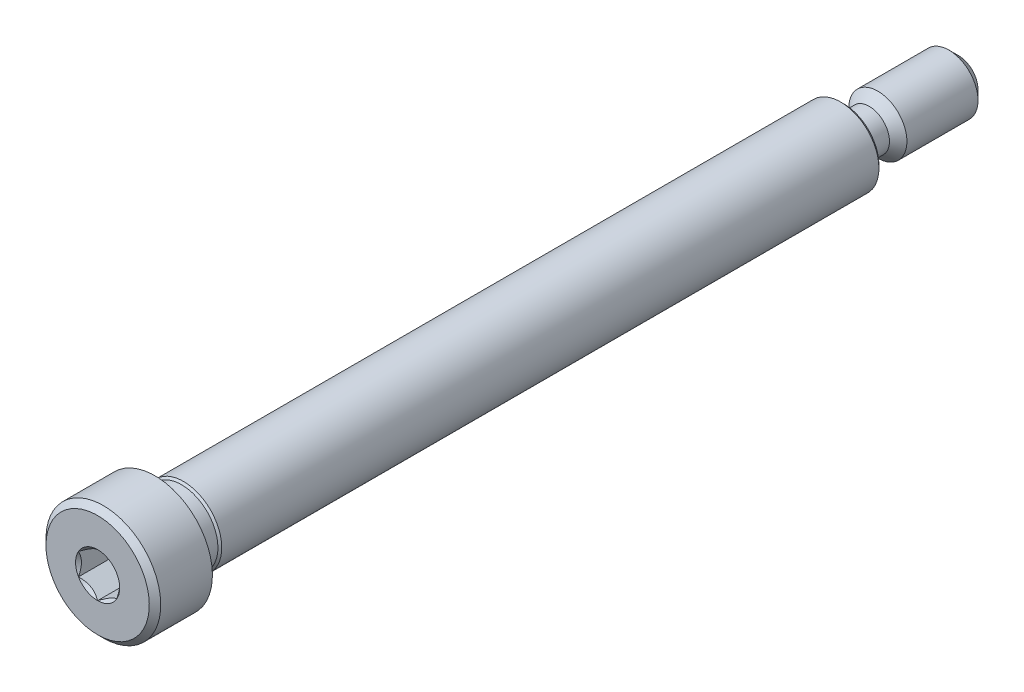
ISO-10303-21;
HEADER;
FILE_DESCRIPTION(('STEP AP214'),'2;1');
FILE_NAME('part.step','',(''),(''),'','','');
FILE_SCHEMA(('AUTOMOTIVE_DESIGN { 1 0 10303 214 1 1 1 1 }'));
ENDSEC;
DATA;
#1=APPLICATION_CONTEXT('core data for automotive mechanical design processes');
#2=APPLICATION_PROTOCOL_DEFINITION('international standard','automotive_design',2000,#1);
#3=PRODUCT_CONTEXT('',#1,'mechanical');
#4=PRODUCT('Part','Part','',(#3));
#5=PRODUCT_RELATED_PRODUCT_CATEGORY('part','',(#4));
#6=PRODUCT_DEFINITION_FORMATION('','',#4);
#7=PRODUCT_DEFINITION_CONTEXT('part definition',#1,'design');
#8=PRODUCT_DEFINITION('design','',#6,#7);
#9=PRODUCT_DEFINITION_SHAPE('','',#8);
#10=(LENGTH_UNIT() NAMED_UNIT(*) SI_UNIT(.MILLI.,.METRE.));
#11=(NAMED_UNIT(*) PLANE_ANGLE_UNIT() SI_UNIT($,.RADIAN.));
#12=(NAMED_UNIT(*) SI_UNIT($,.STERADIAN.) SOLID_ANGLE_UNIT());
#13=UNCERTAINTY_MEASURE_WITH_UNIT(LENGTH_MEASURE(1.E-05),#10,'distance_accuracy_value','');
#14=(GEOMETRIC_REPRESENTATION_CONTEXT(3) GLOBAL_UNCERTAINTY_ASSIGNED_CONTEXT((#13)) GLOBAL_UNIT_ASSIGNED_CONTEXT((#10,
#11,#12)) REPRESENTATION_CONTEXT('',''));
#15=CARTESIAN_POINT('',(0.,0.,0.));
#16=DIRECTION('',(0.,0.,1.));
#17=DIRECTION('',(1.,0.,0.));
#18=AXIS2_PLACEMENT_3D('',#15,#16,#17);
#19=CARTESIAN_POINT('',(0.,4.28625,35.71875));
#20=DIRECTION('',(0.,0.,-1.));
#21=DIRECTION('',(0.,1.,0.));
#22=AXIS2_PLACEMENT_3D('',#19,#20,#21);
#23=PLANE('',#22);
#24=CARTESIAN_POINT('',(0.,0.,35.71875));
#25=DIRECTION('',(0.,0.,1.));
#26=DIRECTION('',(1.,0.,0.));
#27=AXIS2_PLACEMENT_3D('',#24,#25,#26);
#28=CIRCLE('',#27,1.83308710467706);
#29=CARTESIAN_POINT('',(0.,1.83308710467706,35.71875));
#30=VERTEX_POINT('',#29);
#31=CARTESIAN_POINT('',(-1.5875,0.916543552338532,35.71875));
#32=VERTEX_POINT('',#31);
#33=EDGE_CURVE('E129',#30,#32,#28,.T.);
#34=ORIENTED_EDGE('',*,*,#33,.F.);
#35=CARTESIAN_POINT('',(1.5875,0.916543552338532,35.71875));
#36=VERTEX_POINT('',#35);
#37=EDGE_CURVE('E102',#36,#30,#28,.T.);
#38=ORIENTED_EDGE('',*,*,#37,.F.);
#39=CARTESIAN_POINT('',(1.5875,-0.916543552338532,35.71875));
#40=VERTEX_POINT('',#39);
#41=EDGE_CURVE('E92',#40,#36,#28,.T.);
#42=ORIENTED_EDGE('',*,*,#41,.F.);
#43=CARTESIAN_POINT('',(0.,-1.83308710467706,35.71875));
#44=VERTEX_POINT('',#43);
#45=EDGE_CURVE('E53',#44,#40,#28,.T.);
#46=ORIENTED_EDGE('',*,*,#45,.F.);
#47=CARTESIAN_POINT('',(-1.5875,-0.916543552338531,35.71875));
#48=VERTEX_POINT('',#47);
#49=EDGE_CURVE('E60',#48,#44,#28,.T.);
#50=ORIENTED_EDGE('',*,*,#49,.F.);
#51=EDGE_CURVE('E134',#32,#48,#28,.T.);
#52=ORIENTED_EDGE('',*,*,#51,.F.);
#53=EDGE_LOOP('',(#34,#38,#42,#46,#50,#52));
#54=FACE_BOUND('',#53,.T.);
#55=CARTESIAN_POINT('',(0.,0.,35.71875));
#56=DIRECTION('',(0.,0.,1.));
#57=DIRECTION('',(0.,-1.,0.));
#58=AXIS2_PLACEMENT_3D('',#55,#56,#57);
#59=CIRCLE('',#58,4.28625);
#60=CARTESIAN_POINT('',(0.,-4.28625,35.71875));
#61=VERTEX_POINT('',#60);
#62=EDGE_CURVE('E47',#61,#61,#59,.T.);
#63=ORIENTED_EDGE('',*,*,#62,.T.);
#64=EDGE_LOOP('',(#63));
#65=FACE_BOUND('',#64,.T.);
#66=ADVANCED_FACE('F39',(#54,#65),#23,.F.);
#67=CARTESIAN_POINT('',(0.,0.,35.2425));
#68=DIRECTION('',(0.,0.,-1.));
#69=DIRECTION('',(0.,1.,0.));
#70=AXIS2_PLACEMENT_3D('',#67,#68,#69);
#71=CONICAL_SURFACE('',#70,4.7625,0.785398163397443);
#72=ORIENTED_EDGE('',*,*,#62,.F.);
#73=EDGE_LOOP('',(#72));
#74=FACE_BOUND('',#73,.T.);
#75=CARTESIAN_POINT('',(0.,0.,35.2425));
#76=DIRECTION('',(0.,0.,1.));
#77=DIRECTION('',(0.,-1.,0.));
#78=AXIS2_PLACEMENT_3D('',#75,#76,#77);
#79=CIRCLE('',#78,4.7625);
#80=CARTESIAN_POINT('',(0.,-4.7625,35.2425));
#81=VERTEX_POINT('',#80);
#82=EDGE_CURVE('E304',#81,#81,#79,.T.);
#83=ORIENTED_EDGE('',*,*,#82,.T.);
#84=EDGE_LOOP('',(#83));
#85=FACE_BOUND('',#84,.T.);
#86=ADVANCED_FACE('F207',(#74,#85),#71,.T.);
#87=CARTESIAN_POINT('',(0.,0.,35.71875));
#88=DIRECTION('',(0.,0.,1.));
#89=DIRECTION('',(0.,-1.,0.));
#90=AXIS2_PLACEMENT_3D('',#87,#88,#89);
#91=CYLINDRICAL_SURFACE('',#90,4.7625);
#92=ORIENTED_EDGE('',*,*,#82,.F.);
#93=EDGE_LOOP('',(#92));
#94=FACE_BOUND('',#93,.T.);
#95=CARTESIAN_POINT('',(0.,0.,30.95625));
#96=DIRECTION('',(0.,0.,1.));
#97=DIRECTION('',(0.,-1.,0.));
#98=AXIS2_PLACEMENT_3D('',#95,#96,#97);
#99=CIRCLE('',#98,4.7625);
#100=CARTESIAN_POINT('',(0.,-4.7625,30.95625));
#101=VERTEX_POINT('',#100);
#102=EDGE_CURVE('E301',#101,#101,#99,.T.);
#103=ORIENTED_EDGE('',*,*,#102,.T.);
#104=EDGE_LOOP('',(#103));
#105=FACE_BOUND('',#104,.T.);
#106=ADVANCED_FACE('F211',(#94,#105),#91,.T.);
#107=CARTESIAN_POINT('',(0.,4.7625,30.95625));
#108=DIRECTION('',(0.,0.,1.));
#109=DIRECTION('',(0.,-1.,0.));
#110=AXIS2_PLACEMENT_3D('',#107,#108,#109);
#111=PLANE('',#110);
#112=ORIENTED_EDGE('',*,*,#102,.F.);
#113=EDGE_LOOP('',(#112));
#114=FACE_BOUND('',#113,.T.);
#115=CARTESIAN_POINT('',(0.,0.,30.95625));
#116=DIRECTION('',(0.,0.,1.));
#117=DIRECTION('',(0.,-1.,0.));
#118=AXIS2_PLACEMENT_3D('',#115,#116,#117);
#119=CIRCLE('',#118,3.175);
#120=CARTESIAN_POINT('',(0.,-3.175,30.95625));
#121=VERTEX_POINT('',#120);
#122=EDGE_CURVE('E298',#121,#121,#119,.T.);
#123=ORIENTED_EDGE('',*,*,#122,.T.);
#124=EDGE_LOOP('',(#123));
#125=FACE_BOUND('',#124,.T.);
#126=ADVANCED_FACE('F216',(#114,#125),#111,.F.);
#127=CARTESIAN_POINT('',(0.,0.,30.7975));
#128=DIRECTION('',(0.,0.,1.));
#129=DIRECTION('',(0.,-1.,0.));
#130=AXIS2_PLACEMENT_3D('',#127,#128,#129);
#131=CONICAL_SURFACE('',#130,3.01625,0.785398163397454);
#132=ORIENTED_EDGE('',*,*,#122,.F.);
#133=EDGE_LOOP('',(#132));
#134=FACE_BOUND('',#133,.T.);
#135=CARTESIAN_POINT('',(0.,0.,30.7975));
#136=DIRECTION('',(0.,0.,1.));
#137=DIRECTION('',(0.,-1.,0.));
#138=AXIS2_PLACEMENT_3D('',#135,#136,#137);
#139=CIRCLE('',#138,3.01625);
#140=CARTESIAN_POINT('',(0.,-3.01625,30.7975));
#141=VERTEX_POINT('',#140);
#142=EDGE_CURVE('E295',#141,#141,#139,.T.);
#143=ORIENTED_EDGE('',*,*,#142,.T.);
#144=EDGE_LOOP('',(#143));
#145=FACE_BOUND('',#144,.T.);
#146=ADVANCED_FACE('F224',(#134,#145),#131,.T.);
#147=CARTESIAN_POINT('',(0.,0.,35.71875));
#148=DIRECTION('',(0.,0.,1.));
#149=DIRECTION('',(0.,-1.,0.));
#150=AXIS2_PLACEMENT_3D('',#147,#148,#149);
#151=CYLINDRICAL_SURFACE('',#150,3.01625);
#152=ORIENTED_EDGE('',*,*,#142,.F.);
#153=EDGE_LOOP('',(#152));
#154=FACE_BOUND('',#153,.T.);
#155=CARTESIAN_POINT('',(0.,0.,28.7528));
#156=DIRECTION('',(0.,0.,1.));
#157=DIRECTION('',(0.,-1.,0.));
#158=AXIS2_PLACEMENT_3D('',#155,#156,#157);
#159=CIRCLE('',#158,3.01625);
#160=CARTESIAN_POINT('',(0.,-3.01625,28.7528));
#161=VERTEX_POINT('',#160);
#162=EDGE_CURVE('E292',#161,#161,#159,.T.);
#163=ORIENTED_EDGE('',*,*,#162,.T.);
#164=EDGE_LOOP('',(#163));
#165=FACE_BOUND('',#164,.T.);
#166=ADVANCED_FACE('F228',(#154,#165),#151,.T.);
#167=CARTESIAN_POINT('',(0.,0.,28.59405));
#168=DIRECTION('',(0.,0.,-1.));
#169=DIRECTION('',(0.,1.,0.));
#170=AXIS2_PLACEMENT_3D('',#167,#168,#169);
#171=CONICAL_SURFACE('',#170,3.175,0.785398163397451);
#172=ORIENTED_EDGE('',*,*,#162,.F.);
#173=EDGE_LOOP('',(#172));
#174=FACE_BOUND('',#173,.T.);
#175=CARTESIAN_POINT('',(0.,0.,28.59405));
#176=DIRECTION('',(0.,0.,1.));
#177=DIRECTION('',(0.,-1.,0.));
#178=AXIS2_PLACEMENT_3D('',#175,#176,#177);
#179=CIRCLE('',#178,3.175);
#180=CARTESIAN_POINT('',(0.,-3.175,28.59405));
#181=VERTEX_POINT('',#180);
#182=EDGE_CURVE('E289',#181,#181,#179,.T.);
#183=ORIENTED_EDGE('',*,*,#182,.T.);
#184=EDGE_LOOP('',(#183));
#185=FACE_BOUND('',#184,.T.);
#186=ADVANCED_FACE('F232',(#174,#185),#171,.T.);
#187=CARTESIAN_POINT('',(0.,0.,35.71875));
#188=DIRECTION('',(0.,0.,1.));
#189=DIRECTION('',(0.,-1.,0.));
#190=AXIS2_PLACEMENT_3D('',#187,#188,#189);
#191=CYLINDRICAL_SURFACE('',#190,3.175);
#192=ORIENTED_EDGE('',*,*,#182,.F.);
#193=EDGE_LOOP('',(#192));
#194=FACE_BOUND('',#193,.T.);
#195=CARTESIAN_POINT('',(0.,0.,-25.93975));
#196=DIRECTION('',(0.,0.,1.));
#197=DIRECTION('',(0.,-1.,0.));
#198=AXIS2_PLACEMENT_3D('',#195,#196,#197);
#199=CIRCLE('',#198,3.175);
#200=CARTESIAN_POINT('',(0.,-3.175,-25.93975));
#201=VERTEX_POINT('',#200);
#202=EDGE_CURVE('E286',#201,#201,#199,.T.);
#203=ORIENTED_EDGE('',*,*,#202,.T.);
#204=EDGE_LOOP('',(#203));
#205=FACE_BOUND('',#204,.T.);
#206=ADVANCED_FACE('F236',(#194,#205),#191,.T.);
#207=CARTESIAN_POINT('',(0.,0.,-26.19375));
#208=DIRECTION('',(0.,0.,1.));
#209=DIRECTION('',(0.,-1.,0.));
#210=AXIS2_PLACEMENT_3D('',#207,#208,#209);
#211=CONICAL_SURFACE('',#210,2.921,0.785398163397442);
#212=ORIENTED_EDGE('',*,*,#202,.F.);
#213=EDGE_LOOP('',(#212));
#214=FACE_BOUND('',#213,.T.);
#215=CARTESIAN_POINT('',(0.,0.,-26.19375));
#216=DIRECTION('',(0.,0.,1.));
#217=DIRECTION('',(0.,-1.,0.));
#218=AXIS2_PLACEMENT_3D('',#215,#216,#217);
#219=CIRCLE('',#218,2.921);
#220=CARTESIAN_POINT('',(0.,-2.921,-26.19375));
#221=VERTEX_POINT('',#220);
#222=EDGE_CURVE('E274',#221,#221,#219,.T.);
#223=ORIENTED_EDGE('',*,*,#222,.T.);
#224=EDGE_LOOP('',(#223));
#225=FACE_BOUND('',#224,.T.);
#226=ADVANCED_FACE('F240',(#214,#225),#211,.T.);
#227=CARTESIAN_POINT('',(0.,2.921,-26.19375));
#228=DIRECTION('',(0.,0.,1.));
#229=DIRECTION('',(0.,-1.,0.));
#230=AXIS2_PLACEMENT_3D('',#227,#228,#229);
#231=PLANE('',#230);
#232=CARTESIAN_POINT('',(0.,0.,-26.19375));
#233=DIRECTION('',(0.,0.,-1.));
#234=DIRECTION('',(0.,1.,0.));
#235=AXIS2_PLACEMENT_3D('',#232,#233,#234);
#236=CIRCLE('',#235,2.413);
#237=CARTESIAN_POINT('',(0.,2.413,-26.19375));
#238=VERTEX_POINT('',#237);
#239=EDGE_CURVE('E588',#238,#238,#236,.T.);
#240=ORIENTED_EDGE('',*,*,#239,.F.);
#241=EDGE_LOOP('',(#240));
#242=FACE_BOUND('',#241,.T.);
#243=ORIENTED_EDGE('',*,*,#222,.F.);
#244=EDGE_LOOP('',(#243));
#245=FACE_BOUND('',#244,.T.);
#246=ADVANCED_FACE('F244',(#242,#245),#231,.F.);
#247=CARTESIAN_POINT('',(0.,0.,35.71875));
#248=DIRECTION('',(0.,0.,1.));
#249=DIRECTION('',(1.,0.,0.));
#250=AXIS2_PLACEMENT_3D('',#247,#248,#249);
#251=CONICAL_SURFACE('',#250,1.83308710467706,0.78539816339745);
#252=ORIENTED_EDGE('',*,*,#37,.T.);
#253=CARTESIAN_POINT('',(1.5877,0.916428082284693,35.7188654809637));
#254=CARTESIAN_POINT('',(1.53312479190086,0.947937093371809,35.6873808083706));
#255=CARTESIAN_POINT('',(1.47763696320971,0.979973006203394,35.6577450460135));
#256=CARTESIAN_POINT('',(1.36449087915364,1.04529792829092,35.6034822600208));
#257=CARTESIAN_POINT('',(1.30682185887062,1.07859315267522,35.5788854351332));
#258=CARTESIAN_POINT('',(1.1905349781269,1.14573141457583,35.5367503642726));
#259=CARTESIAN_POINT('',(1.13194674474407,1.17955734689075,35.5191061927298));
#260=CARTESIAN_POINT('',(1.01348022674557,1.24795402294715,35.491921470085));
#261=CARTESIAN_POINT('',(0.953605562983895,1.28252267618759,35.4823606206951));
#262=CARTESIAN_POINT('',(0.850418771876558,1.34209759781022,35.473734413104));
#263=CARTESIAN_POINT('',(0.807240015952288,1.36702686416637,35.4724571928096));
#264=CARTESIAN_POINT('',(0.720953038535399,1.41684467380557,35.4746070558147));
#265=CARTESIAN_POINT('',(0.677844847078613,1.44173319974742,35.4780357885493));
#266=CARTESIAN_POINT('',(0.592046335002032,1.49126899379091,35.4894009944333));
#267=CARTESIAN_POINT('',(0.549356408925407,1.51591603410293,35.4973413718016));
#268=CARTESIAN_POINT('',(0.464693063478359,1.56479643938728,35.5172984144511));
#269=CARTESIAN_POINT('',(0.422719959755075,1.58902962212064,35.5293168292087));
#270=CARTESIAN_POINT('',(0.315211458113567,1.65109968448354,35.5649968972472));
#271=CARTESIAN_POINT('',(0.250342771708901,1.68855163804125,35.5913485723031));
#272=CARTESIAN_POINT('',(0.154961599380924,1.74361998356043,35.6358335368517));
#273=CARTESIAN_POINT('',(0.123530699536156,1.76176662204668,35.6514628578011));
#274=CARTESIAN_POINT('',(0.0612469855696357,1.79772614107138,35.6841484878611));
#275=CARTESIAN_POINT('',(0.030393903960575,1.8155391760437,35.701204115657));
#276=CARTESIAN_POINT('',(-0.000200000000001308,1.8332025747309,35.7188654809637));
#277=B_SPLINE_CURVE_WITH_KNOTS('',3,(#253,#254,#255,#256,#257,#258,#259,#260,#261,#262,#263,
#264,#265,#266,#267,#268,#269,#270,#271,#272,#273,#274,#275,#276),.UNSPECIFIED.,.F.,.F.,(4,2,2,
2,2,2,2,2,2,2,2,4),(0.,0.211482650810816,0.424197870807277,0.633533884524819,0.842342653263348,
0.991755553727141,1.14122083674204,1.29081565918877,1.44047473906438,1.6781878086972,
1.79671410024894,1.91518409436631),.UNSPECIFIED.);
#278=EDGE_CURVE('E11',#36,#30,#277,.T.);
#279=ORIENTED_EDGE('',*,*,#278,.F.);
#280=EDGE_LOOP('',(#252,#279));
#281=FACE_BOUND('',#280,.T.);
#282=ADVANCED_FACE('F105',(#281),#251,.F.);
#283=ORIENTED_EDGE('',*,*,#33,.T.);
#284=CARTESIAN_POINT('',(0.000199999999999792,1.8332025747309,35.7188654809637));
#285=CARTESIAN_POINT('',(-0.0543752080991364,1.80169356364378,35.6873808083706));
#286=CARTESIAN_POINT('',(-0.10986303679029,1.7696576508122,35.6577450460135));
#287=CARTESIAN_POINT('',(-0.223009120846359,1.70433272872468,35.6034822600208));
#288=CARTESIAN_POINT('',(-0.280678141129381,1.67103750434037,35.5788854351332));
#289=CARTESIAN_POINT('',(-0.396965021873104,1.60389924243976,35.5367503642726));
#290=CARTESIAN_POINT('',(-0.455553255255931,1.57007331012484,35.5191061927298));
#291=CARTESIAN_POINT('',(-0.574019773254431,1.50167663406845,35.491921470085));
#292=CARTESIAN_POINT('',(-0.633894437016104,1.46710798082801,35.4823606206951));
#293=CARTESIAN_POINT('',(-0.737081228123441,1.40753305920537,35.473734413104));
#294=CARTESIAN_POINT('',(-0.780259984047711,1.38260379284922,35.4724571928096));
#295=CARTESIAN_POINT('',(-0.8665469614646,1.33278598321002,35.4746070558147));
#296=CARTESIAN_POINT('',(-0.909655152921387,1.30789745726817,35.4780357885493));
#297=CARTESIAN_POINT('',(-0.995453664997968,1.25836166322469,35.4894009944333));
#298=CARTESIAN_POINT('',(-1.03814359107459,1.23371462291266,35.4973413718016));
#299=CARTESIAN_POINT('',(-1.12280693652164,1.18483421762831,35.5172984144511));
#300=CARTESIAN_POINT('',(-1.16478004024492,1.16060103489495,35.5293168292087));
#301=CARTESIAN_POINT('',(-1.27228854188643,1.09853097253205,35.5649968972472));
#302=CARTESIAN_POINT('',(-1.3371572282911,1.06107901897434,35.5913485723031));
#303=CARTESIAN_POINT('',(-1.43253840061908,1.00601067345516,35.6358335368517));
#304=CARTESIAN_POINT('',(-1.46396930046384,0.987864034968914,35.6514628578011));
#305=CARTESIAN_POINT('',(-1.52625301443036,0.951904515944214,35.6841484878611));
#306=CARTESIAN_POINT('',(-1.55710609603942,0.934091480971893,35.701204115657));
#307=CARTESIAN_POINT('',(-1.5877,0.916428082284693,35.7188654809637));
#308=B_SPLINE_CURVE_WITH_KNOTS('',3,(#284,#285,#286,#287,#288,#289,#290,#291,#292,#293,#294,
#295,#296,#297,#298,#299,#300,#301,#302,#303,#304,#305,#306,#307),.UNSPECIFIED.,.F.,.F.,(4,2,2,
2,2,2,2,2,2,2,2,4),(0.,0.211482650810817,0.424197870807277,0.633533884524815,0.842342653263347,
0.99175555372714,1.14122083674204,1.29081565918877,1.44047473906438,1.6781878086972,
1.79671410024894,1.91518409436631),.UNSPECIFIED.);
#309=EDGE_CURVE('E130',#30,#32,#308,.T.);
#310=ORIENTED_EDGE('',*,*,#309,.F.);
#311=EDGE_LOOP('',(#283,#310));
#312=FACE_BOUND('',#311,.T.);
#313=ADVANCED_FACE('F337',(#312),#251,.F.);
#314=ORIENTED_EDGE('',*,*,#51,.T.);
#315=CARTESIAN_POINT('',(-1.5875,-1.82796193726258,36.3067372630533));
#316=CARTESIAN_POINT('',(-1.5875,-1.78345227615058,36.2731366524824));
#317=CARTESIAN_POINT('',(-1.5875,-1.73869460859012,36.2398654951128));
#318=CARTESIAN_POINT('',(-1.5875,-1.64858256596371,36.1741181176639));
#319=CARTESIAN_POINT('',(-1.5875,-1.60322804392556,36.1416420992359));
#320=CARTESIAN_POINT('',(-1.5875,-1.4654544197676,36.0451476119854));
#321=CARTESIAN_POINT('',(-1.5875,-1.37200191342499,35.98258016346));
#322=CARTESIAN_POINT('',(-1.5875,-1.17603564989744,35.859752804435));
#323=CARTESIAN_POINT('',(-1.5875,-1.07330915468726,35.7998284496591));
#324=CARTESIAN_POINT('',(-1.5875,-0.862725191083293,35.6902140326728));
#325=CARTESIAN_POINT('',(-1.5875,-0.754886591626389,35.6404894689649));
#326=CARTESIAN_POINT('',(-1.5875,-0.593019911814787,35.5796560740893));
#327=CARTESIAN_POINT('',(-1.5875,-0.541388281953339,35.5621964520431));
#328=CARTESIAN_POINT('',(-1.5875,-0.436878539644846,35.5314223678478));
#329=CARTESIAN_POINT('',(-1.5875,-0.384000341596418,35.518108191262));
#330=CARTESIAN_POINT('',(-1.5875,-0.278196924179272,35.496538305472));
#331=CARTESIAN_POINT('',(-1.5875,-0.225289653780157,35.4881959279895));
#332=CARTESIAN_POINT('',(-1.5875,-0.118909299444437,35.4767325177005));
#333=CARTESIAN_POINT('',(-1.5875,-0.0654363143610342,35.4736105873549));
#334=CARTESIAN_POINT('',(-1.5875,0.0396125417767687,35.4728196410921));
#335=CARTESIAN_POINT('',(-1.5875,0.0911870236203118,35.4749573430156));
#336=CARTESIAN_POINT('',(-1.5875,0.19389400913867,35.4841413684824));
#337=CARTESIAN_POINT('',(-1.5875,0.24502646938883,35.491188168875));
#338=CARTESIAN_POINT('',(-1.5875,0.347344844875249,35.5099252166964));
#339=CARTESIAN_POINT('',(-1.5875,0.398516068928428,35.5216944835804));
#340=CARTESIAN_POINT('',(-1.5875,0.499740446124589,35.5492509465349));
#341=CARTESIAN_POINT('',(-1.5875,0.549793692439814,35.56503780641));
#342=CARTESIAN_POINT('',(-1.5875,0.707380774187257,35.6206797783058));
#343=CARTESIAN_POINT('',(-1.5875,0.812671634229882,35.6668718625745));
#344=CARTESIAN_POINT('',(-1.5875,1.01830702558101,35.7695743359444));
#345=CARTESIAN_POINT('',(-1.5875,1.11863208625861,35.8261217955531));
#346=CARTESIAN_POINT('',(-1.5875,1.31036772822829,35.9427841933715));
#347=CARTESIAN_POINT('',(-1.5875,1.40197355475198,36.0025822160727));
#348=CARTESIAN_POINT('',(-1.5875,1.53693633949295,36.0950238025041));
#349=CARTESIAN_POINT('',(-1.5875,1.58134147344182,36.1261636279364));
#350=CARTESIAN_POINT('',(-1.5875,1.66954488852478,36.1892668197706));
#351=CARTESIAN_POINT('',(-1.5875,1.71334333318449,36.2212299573449));
#352=CARTESIAN_POINT('',(-1.5875,1.75688919237297,36.2535344890283));
#353=B_SPLINE_CURVE_WITH_KNOTS('',3,(#315,#316,#317,#318,#319,#320,#321,#322,#323,#324,#325,
#326,#327,#328,#329,#330,#331,#332,#333,#334,#335,#336,#337,#338,#339,#340,#341,#342,#343,#344,
#345,#346,#347,#348,#349,#350,#351,#352),.UNSPECIFIED.,.F.,.F.,(4,2,2,2,2,2,2,2,2,2,2,2,2,2,2,2,
2,2,4),(0.,0.167300856006662,0.334643709885261,0.671883358358865,1.02837224619093,
1.38363464340873,1.54700775526169,1.7103921187555,1.87083807337658,2.03125644006702,
2.18586834446826,2.340495269317,2.49782525404181,2.65514207759267,2.99906299922328,
3.3442400622648,3.67226428573991,3.8349649830897,3.9976209379619),.UNSPECIFIED.);
#354=EDGE_CURVE('E132',#32,#48,#353,.F.);
#355=ORIENTED_EDGE('',*,*,#354,.F.);
#356=EDGE_LOOP('',(#314,#355));
#357=FACE_BOUND('',#356,.T.);
#358=ADVANCED_FACE('F330',(#357),#251,.F.);
#359=ORIENTED_EDGE('',*,*,#49,.T.);
#360=CARTESIAN_POINT('',(-1.5877,-0.916428082284692,35.7188654809637));
#361=CARTESIAN_POINT('',(-1.53312479190087,-0.947937093371808,35.6873808083706));
#362=CARTESIAN_POINT('',(-1.47763696320971,-0.979973006203393,35.6577450460135));
#363=CARTESIAN_POINT('',(-1.36449087915364,-1.04529792829092,35.6034822600208));
#364=CARTESIAN_POINT('',(-1.30682185887062,-1.07859315267522,35.5788854351332));
#365=CARTESIAN_POINT('',(-1.1905349781269,-1.14573141457583,35.5367503642726));
#366=CARTESIAN_POINT('',(-1.13194674474407,-1.17955734689075,35.5191061927298));
#367=CARTESIAN_POINT('',(-1.01348022674557,-1.24795402294714,35.491921470085));
#368=CARTESIAN_POINT('',(-0.953605562983896,-1.28252267618758,35.4823606206951));
#369=CARTESIAN_POINT('',(-0.850418771876558,-1.34209759781022,35.473734413104));
#370=CARTESIAN_POINT('',(-0.807240015952289,-1.36702686416637,35.4724571928096));
#371=CARTESIAN_POINT('',(-0.7209530385354,-1.41684467380557,35.4746070558147));
#372=CARTESIAN_POINT('',(-0.677844847078613,-1.44173319974742,35.4780357885493));
#373=CARTESIAN_POINT('',(-0.592046335002032,-1.49126899379091,35.4894009944333));
#374=CARTESIAN_POINT('',(-0.549356408925407,-1.51591603410293,35.4973413718016));
#375=CARTESIAN_POINT('',(-0.46469306347836,-1.56479643938728,35.5172984144511));
#376=CARTESIAN_POINT('',(-0.422719959755076,-1.58902962212064,35.5293168292087));
#377=CARTESIAN_POINT('',(-0.315211458113567,-1.65109968448354,35.5649968972472));
#378=CARTESIAN_POINT('',(-0.250342771708901,-1.68855163804125,35.5913485723031));
#379=CARTESIAN_POINT('',(-0.154961599380924,-1.74361998356043,35.6358335368517));
#380=CARTESIAN_POINT('',(-0.123530699536156,-1.76176662204668,35.6514628578011));
#381=CARTESIAN_POINT('',(-0.0612469855696358,-1.79772614107138,35.6841484878611));
#382=CARTESIAN_POINT('',(-0.0303939039605753,-1.8155391760437,35.701204115657));
#383=CARTESIAN_POINT('',(0.000200000000000904,-1.8332025747309,35.7188654809637));
#384=B_SPLINE_CURVE_WITH_KNOTS('',3,(#360,#361,#362,#363,#364,#365,#366,#367,#368,#369,#370,
#371,#372,#373,#374,#375,#376,#377,#378,#379,#380,#381,#382,#383),.UNSPECIFIED.,.F.,.F.,(4,2,2,
2,2,2,2,2,2,2,2,4),(0.,0.211482650810816,0.424197870807276,0.633533884524816,0.842342653263349,
0.991755553727142,1.14122083674205,1.29081565918877,1.44047473906438,1.6781878086972,
1.79671410024894,1.91518409436631),.UNSPECIFIED.);
#385=EDGE_CURVE('E172',#48,#44,#384,.T.);
#386=ORIENTED_EDGE('',*,*,#385,.F.);
#387=EDGE_LOOP('',(#359,#386));
#388=FACE_BOUND('',#387,.T.);
#389=ADVANCED_FACE('F331',(#388),#251,.F.);
#390=ORIENTED_EDGE('',*,*,#45,.T.);
#391=CARTESIAN_POINT('',(-0.000200000000000932,-1.8332025747309,35.7188654809637));
#392=CARTESIAN_POINT('',(0.0543752080991348,-1.80169356364378,35.6873808083706));
#393=CARTESIAN_POINT('',(0.109863036790288,-1.7696576508122,35.6577450460135));
#394=CARTESIAN_POINT('',(0.223009120846358,-1.70433272872468,35.6034822600208));
#395=CARTESIAN_POINT('',(0.28067814112938,-1.67103750434037,35.5788854351332));
#396=CARTESIAN_POINT('',(0.396965021873103,-1.60389924243976,35.5367503642726));
#397=CARTESIAN_POINT('',(0.455553255255932,-1.57007331012484,35.5191061927298));
#398=CARTESIAN_POINT('',(0.574019773254431,-1.50167663406845,35.491921470085));
#399=CARTESIAN_POINT('',(0.633894437016104,-1.46710798082801,35.4823606206951));
#400=CARTESIAN_POINT('',(0.737081228123441,-1.40753305920537,35.473734413104));
#401=CARTESIAN_POINT('',(0.780259984047711,-1.38260379284922,35.4724571928096));
#402=CARTESIAN_POINT('',(0.8665469614646,-1.33278598321002,35.4746070558147));
#403=CARTESIAN_POINT('',(0.909655152921386,-1.30789745726817,35.4780357885493));
#404=CARTESIAN_POINT('',(0.995453664997968,-1.25836166322469,35.4894009944333));
#405=CARTESIAN_POINT('',(1.03814359107459,-1.23371462291266,35.4973413718016));
#406=CARTESIAN_POINT('',(1.12280693652164,-1.18483421762831,35.5172984144511));
#407=CARTESIAN_POINT('',(1.16478004024492,-1.16060103489495,35.5293168292087));
#408=CARTESIAN_POINT('',(1.27228854188643,-1.09853097253205,35.5649968972472));
#409=CARTESIAN_POINT('',(1.3371572282911,-1.06107901897434,35.5913485723031));
#410=CARTESIAN_POINT('',(1.43253840061908,-1.00601067345516,35.6358335368517));
#411=CARTESIAN_POINT('',(1.46396930046384,-0.987864034968914,35.6514628578011));
#412=CARTESIAN_POINT('',(1.52625301443036,-0.951904515944213,35.6841484878611));
#413=CARTESIAN_POINT('',(1.55710609603942,-0.934091480971893,35.701204115657));
#414=CARTESIAN_POINT('',(1.5877,-0.916428082284693,35.7188654809637));
#415=B_SPLINE_CURVE_WITH_KNOTS('',3,(#391,#392,#393,#394,#395,#396,#397,#398,#399,#400,#401,
#402,#403,#404,#405,#406,#407,#408,#409,#410,#411,#412,#413,#414),.UNSPECIFIED.,.F.,.F.,(4,2,2,
2,2,2,2,2,2,2,2,4),(0.,0.211482650810816,0.424197870807277,0.633533884524819,0.842342653263349,
0.991755553727141,1.14122083674204,1.29081565918877,1.44047473906438,1.6781878086972,
1.79671410024894,1.91518409436631),.UNSPECIFIED.);
#416=EDGE_CURVE('E117',#44,#40,#415,.T.);
#417=ORIENTED_EDGE('',*,*,#416,.F.);
#418=EDGE_LOOP('',(#390,#417));
#419=FACE_BOUND('',#418,.T.);
#420=ADVANCED_FACE('F158',(#419),#251,.F.);
#421=ORIENTED_EDGE('',*,*,#41,.T.);
#422=CARTESIAN_POINT('',(1.5875,-1.82796193752854,36.3067372632541));
#423=CARTESIAN_POINT('',(1.5875,-1.78345227640909,36.2731366526755));
#424=CARTESIAN_POINT('',(1.5875,-1.73869460884114,36.2398654952982));
#425=CARTESIAN_POINT('',(1.5875,-1.64858256619969,36.1741181178338));
#426=CARTESIAN_POINT('',(1.5875,-1.60322804415398,36.1416420993982));
#427=CARTESIAN_POINT('',(1.5875,-1.46545441997287,36.0451476121245));
#428=CARTESIAN_POINT('',(1.5875,-1.37200191361453,35.9825801635837));
#429=CARTESIAN_POINT('',(1.5875,-1.17603565005265,35.859752804527));
#430=CARTESIAN_POINT('',(1.5875,-1.0733091548238,35.799828449735));
#431=CARTESIAN_POINT('',(1.5875,-0.862725191180885,35.6902140327188));
#432=CARTESIAN_POINT('',(1.5875,-0.754886591703731,35.6404894689971));
#433=CARTESIAN_POINT('',(1.5875,-0.593019911876895,35.5796560741112));
#434=CARTESIAN_POINT('',(1.5875,-0.541388282021827,35.5621964520654));
#435=CARTESIAN_POINT('',(1.5875,-0.436878539726303,35.5314223678696));
#436=CARTESIAN_POINT('',(1.5875,-0.384000341684463,35.5181081912829));
#437=CARTESIAN_POINT('',(1.5875,-0.278196924280276,35.4965383054897));
#438=CARTESIAN_POINT('',(1.5875,-0.22528965388753,35.4881959280048));
#439=CARTESIAN_POINT('',(1.5875,-0.118909299564333,35.4767325177097));
#440=CARTESIAN_POINT('',(1.5875,-0.0654363144870846,35.4736105873603));
#441=CARTESIAN_POINT('',(1.5875,0.0396125416393619,35.4728196410889));
#442=CARTESIAN_POINT('',(1.5875,0.0911870234776876,35.4749573430076));
#443=CARTESIAN_POINT('',(1.5875,0.193894008986134,35.484141368464));
#444=CARTESIAN_POINT('',(1.5875,0.245026469231598,35.4911881688511));
#445=CARTESIAN_POINT('',(1.5875,0.347344844708747,35.5099252166609));
#446=CARTESIAN_POINT('',(1.5875,0.398516068757365,35.5216944835388));
#447=CARTESIAN_POINT('',(1.5875,0.499740445944846,35.549250946481));
#448=CARTESIAN_POINT('',(1.5875,0.549793692255952,35.5650378063498));
#449=CARTESIAN_POINT('',(1.5875,0.70738077396336,35.6206797782163));
#450=CARTESIAN_POINT('',(1.5875,0.812671633972076,35.6668718624579));
#451=CARTESIAN_POINT('',(1.5875,1.01830702525799,35.7695743357708));
#452=CARTESIAN_POINT('',(1.5875,1.1186320859043,35.8261217953495));
#453=CARTESIAN_POINT('',(1.5875,1.31036772781773,35.9427841931104));
#454=CARTESIAN_POINT('',(1.5875,1.40197355431624,36.0025822157844));
#455=CARTESIAN_POINT('',(1.5875,1.53693633902001,36.0950238021751));
#456=CARTESIAN_POINT('',(1.5875,1.58134147295665,36.126163627594));
#457=CARTESIAN_POINT('',(1.5875,1.66954488801524,36.1892668194013));
#458=CARTESIAN_POINT('',(1.5875,1.71334333266281,36.2212299569622));
#459=CARTESIAN_POINT('',(1.5875,1.75688919183916,36.2535344886323));
#460=B_SPLINE_CURVE_WITH_KNOTS('',3,(#422,#423,#424,#425,#426,#427,#428,#429,#430,#431,#432,
#433,#434,#435,#436,#437,#438,#439,#440,#441,#442,#443,#444,#445,#446,#447,#448,#449,#450,#451,
#452,#453,#454,#455,#456,#457,#458,#459),.UNSPECIFIED.,.F.,.F.,(4,2,2,2,2,2,2,2,2,2,2,2,2,2,2,2,
2,2,4),(0.,0.167300856038502,0.334643709948952,0.67188335848746,1.02837224639231,
1.38363464368219,1.5470077555167,1.71039211899209,1.87083807359551,2.03125644026828,
2.18586834465336,2.34049526948591,2.4978252541933,2.65514207772674,2.99906299923217,
3.34424006214768,3.67226428551496,3.83496498281158,3.9976209376306),.UNSPECIFIED.);
#461=EDGE_CURVE('E96',#40,#36,#460,.T.);
#462=ORIENTED_EDGE('',*,*,#461,.F.);
#463=EDGE_LOOP('',(#421,#462));
#464=FACE_BOUND('',#463,.T.);
#465=ADVANCED_FACE('F94',(#464),#251,.F.);
#466=CARTESIAN_POINT('',(0.,0.,32.146875));
#467=DIRECTION('',(0.,0.,1.));
#468=DIRECTION('',(1.,0.,0.));
#469=AXIS2_PLACEMENT_3D('',#466,#467,#468);
#470=PLANE('',#469);
#471=DIRECTION('',(0.,1.,0.));
#472=VECTOR('',#471,1.);
#473=CARTESIAN_POINT('',(1.5875,-0.916543552338531,32.146875));
#474=LINE('',#473,#472);
#475=CARTESIAN_POINT('',(1.5875,-0.916543552338531,32.146875));
#476=VERTEX_POINT('',#475);
#477=CARTESIAN_POINT('',(1.5875,0.916543552338532,32.146875));
#478=VERTEX_POINT('',#477);
#479=EDGE_CURVE('E116',#476,#478,#474,.T.);
#480=ORIENTED_EDGE('',*,*,#479,.T.);
#481=DIRECTION('',(-0.866025403784439,0.5,0.));
#482=VECTOR('',#481,1.);
#483=CARTESIAN_POINT('',(1.5875,0.916543552338532,32.146875));
#484=LINE('',#483,#482);
#485=CARTESIAN_POINT('',(0.,1.83308710467706,32.146875));
#486=VERTEX_POINT('',#485);
#487=EDGE_CURVE('E121',#478,#486,#484,.T.);
#488=ORIENTED_EDGE('',*,*,#487,.T.);
#489=DIRECTION('',(-0.866025403784439,-0.5,0.));
#490=VECTOR('',#489,1.);
#491=CARTESIAN_POINT('',(0.,1.83308710467706,32.146875));
#492=LINE('',#491,#490);
#493=CARTESIAN_POINT('',(-1.5875,0.916543552338531,32.146875));
#494=VERTEX_POINT('',#493);
#495=EDGE_CURVE('E263',#486,#494,#492,.T.);
#496=ORIENTED_EDGE('',*,*,#495,.T.);
#497=DIRECTION('',(0.,-1.,0.));
#498=VECTOR('',#497,1.);
#499=CARTESIAN_POINT('',(-1.5875,0.916543552338531,32.146875));
#500=LINE('',#499,#498);
#501=CARTESIAN_POINT('',(-1.5875,-0.91654355233853,32.146875));
#502=VERTEX_POINT('',#501);
#503=EDGE_CURVE('E267',#494,#502,#500,.T.);
#504=ORIENTED_EDGE('',*,*,#503,.T.);
#505=DIRECTION('',(0.866025403784438,-0.5,0.));
#506=VECTOR('',#505,1.);
#507=CARTESIAN_POINT('',(-1.5875,-0.91654355233853,32.146875));
#508=LINE('',#507,#506);
#509=CARTESIAN_POINT('',(0.,-1.83308710467706,32.146875));
#510=VERTEX_POINT('',#509);
#511=EDGE_CURVE('E270',#502,#510,#508,.T.);
#512=ORIENTED_EDGE('',*,*,#511,.T.);
#513=DIRECTION('',(0.866025403784439,0.5,0.));
#514=VECTOR('',#513,1.);
#515=CARTESIAN_POINT('',(0.,-1.83308710467706,32.146875));
#516=LINE('',#515,#514);
#517=EDGE_CURVE('E124',#510,#476,#516,.T.);
#518=ORIENTED_EDGE('',*,*,#517,.T.);
#519=EDGE_LOOP('',(#480,#488,#496,#504,#512,#518));
#520=FACE_BOUND('',#519,.T.);
#521=ADVANCED_FACE('F157',(#520),#470,.T.);
#522=CARTESIAN_POINT('',(1.5875,0.916543552338532,32.146875));
#523=DIRECTION('',(0.5,0.866025403784439,0.));
#524=DIRECTION('',(-0.866025403784439,0.5,0.));
#525=AXIS2_PLACEMENT_3D('',#522,#523,#524);
#526=PLANE('',#525);
#527=DIRECTION('',(0.,0.,1.));
#528=VECTOR('',#527,1.);
#529=CARTESIAN_POINT('',(1.5875,0.916543552338532,32.146875));
#530=LINE('',#529,#528);
#531=EDGE_CURVE('E113',#478,#36,#530,.T.);
#532=ORIENTED_EDGE('',*,*,#531,.T.);
#533=ORIENTED_EDGE('',*,*,#278,.T.);
#534=DIRECTION('',(0.,0.,1.));
#535=VECTOR('',#534,1.);
#536=CARTESIAN_POINT('',(0.,1.83308710467706,32.146875));
#537=LINE('',#536,#535);
#538=EDGE_CURVE('E123',#486,#30,#537,.T.);
#539=ORIENTED_EDGE('',*,*,#538,.F.);
#540=ORIENTED_EDGE('',*,*,#487,.F.);
#541=EDGE_LOOP('',(#532,#533,#539,#540));
#542=FACE_BOUND('',#541,.T.);
#543=ADVANCED_FACE('F119',(#542),#526,.F.);
#544=CARTESIAN_POINT('',(0.,1.83308710467706,32.146875));
#545=DIRECTION('',(-0.5,0.866025403784439,0.));
#546=DIRECTION('',(-0.866025403784439,-0.5,0.));
#547=AXIS2_PLACEMENT_3D('',#544,#545,#546);
#548=PLANE('',#547);
#549=ORIENTED_EDGE('',*,*,#538,.T.);
#550=ORIENTED_EDGE('',*,*,#309,.T.);
#551=DIRECTION('',(0.,0.,1.));
#552=VECTOR('',#551,1.);
#553=CARTESIAN_POINT('',(-1.5875,0.916543552338531,32.146875));
#554=LINE('',#553,#552);
#555=EDGE_CURVE('E281',#494,#32,#554,.T.);
#556=ORIENTED_EDGE('',*,*,#555,.F.);
#557=ORIENTED_EDGE('',*,*,#495,.F.);
#558=EDGE_LOOP('',(#549,#550,#556,#557));
#559=FACE_BOUND('',#558,.T.);
#560=ADVANCED_FACE('F150',(#559),#548,.F.);
#561=CARTESIAN_POINT('',(-1.5875,0.916543552338531,32.146875));
#562=DIRECTION('',(-1.,0.,0.));
#563=DIRECTION('',(0.,-1.,0.));
#564=AXIS2_PLACEMENT_3D('',#561,#562,#563);
#565=PLANE('',#564);
#566=ORIENTED_EDGE('',*,*,#555,.T.);
#567=ORIENTED_EDGE('',*,*,#354,.T.);
#568=DIRECTION('',(0.,0.,1.));
#569=VECTOR('',#568,1.);
#570=CARTESIAN_POINT('',(-1.5875,-0.91654355233853,32.146875));
#571=LINE('',#570,#569);
#572=EDGE_CURVE('E278',#502,#48,#571,.T.);
#573=ORIENTED_EDGE('',*,*,#572,.F.);
#574=ORIENTED_EDGE('',*,*,#503,.F.);
#575=EDGE_LOOP('',(#566,#567,#573,#574));
#576=FACE_BOUND('',#575,.T.);
#577=ADVANCED_FACE('F196',(#576),#565,.F.);
#578=CARTESIAN_POINT('',(-1.5875,-0.91654355233853,32.146875));
#579=DIRECTION('',(-0.5,-0.866025403784439,0.));
#580=DIRECTION('',(0.866025403784439,-0.5,0.));
#581=AXIS2_PLACEMENT_3D('',#578,#579,#580);
#582=PLANE('',#581);
#583=ORIENTED_EDGE('',*,*,#572,.T.);
#584=ORIENTED_EDGE('',*,*,#385,.T.);
#585=DIRECTION('',(0.,0.,1.));
#586=VECTOR('',#585,1.);
#587=CARTESIAN_POINT('',(0.,-1.83308710467706,32.146875));
#588=LINE('',#587,#586);
#589=EDGE_CURVE('E275',#510,#44,#588,.T.);
#590=ORIENTED_EDGE('',*,*,#589,.F.);
#591=ORIENTED_EDGE('',*,*,#511,.F.);
#592=EDGE_LOOP('',(#583,#584,#590,#591));
#593=FACE_BOUND('',#592,.T.);
#594=ADVANCED_FACE('F192',(#593),#582,.F.);
#595=CARTESIAN_POINT('',(0.,-1.83308710467706,32.146875));
#596=DIRECTION('',(0.5,-0.866025403784439,0.));
#597=DIRECTION('',(0.866025403784439,0.5,0.));
#598=AXIS2_PLACEMENT_3D('',#595,#596,#597);
#599=PLANE('',#598);
#600=ORIENTED_EDGE('',*,*,#589,.T.);
#601=ORIENTED_EDGE('',*,*,#416,.T.);
#602=DIRECTION('',(0.,0.,1.));
#603=VECTOR('',#602,1.);
#604=CARTESIAN_POINT('',(1.5875,-0.916543552338531,32.146875));
#605=LINE('',#604,#603);
#606=EDGE_CURVE('E115',#476,#40,#605,.T.);
#607=ORIENTED_EDGE('',*,*,#606,.F.);
#608=ORIENTED_EDGE('',*,*,#517,.F.);
#609=EDGE_LOOP('',(#600,#601,#607,#608));
#610=FACE_BOUND('',#609,.T.);
#611=ADVANCED_FACE('F189',(#610),#599,.F.);
#612=CARTESIAN_POINT('',(1.5875,-0.916543552338531,32.146875));
#613=DIRECTION('',(1.,0.,0.));
#614=DIRECTION('',(0.,1.,0.));
#615=AXIS2_PLACEMENT_3D('',#612,#613,#614);
#616=PLANE('',#615);
#617=ORIENTED_EDGE('',*,*,#606,.T.);
#618=ORIENTED_EDGE('',*,*,#461,.T.);
#619=ORIENTED_EDGE('',*,*,#531,.F.);
#620=ORIENTED_EDGE('',*,*,#479,.F.);
#621=EDGE_LOOP('',(#617,#618,#619,#620));
#622=FACE_BOUND('',#621,.T.);
#623=ADVANCED_FACE('F111',(#622),#616,.F.);
#624=CARTESIAN_POINT('',(0.,0.,-26.91765));
#625=DIRECTION('',(0.,0.,-1.));
#626=DIRECTION('',(0.,1.,0.));
#627=AXIS2_PLACEMENT_3D('',#624,#625,#626);
#628=TOROIDAL_SURFACE('',#627,2.413,0.7239);
#629=CARTESIAN_POINT('',(0.,0.,-26.91765));
#630=DIRECTION('',(0.,0.,-1.));
#631=DIRECTION('',(0.,1.,0.));
#632=AXIS2_PLACEMENT_3D('',#629,#630,#631);
#633=CIRCLE('',#632,1.6891);
#634=CARTESIAN_POINT('',(0.,1.6891,-26.91765));
#635=VERTEX_POINT('',#634);
#636=EDGE_CURVE('E587',#635,#635,#633,.T.);
#637=ORIENTED_EDGE('',*,*,#636,.F.);
#638=EDGE_LOOP('',(#637));
#639=FACE_BOUND('',#638,.T.);
#640=ORIENTED_EDGE('',*,*,#239,.T.);
#641=EDGE_LOOP('',(#640));
#642=FACE_BOUND('',#641,.T.);
#643=ADVANCED_FACE('F250',(#639,#642),#628,.F.);
#644=CARTESIAN_POINT('',(0.,0.,-35.71875));
#645=DIRECTION('',(0.,0.,-1.));
#646=DIRECTION('',(0.,1.,0.));
#647=AXIS2_PLACEMENT_3D('',#644,#645,#646);
#648=CYLINDRICAL_SURFACE('',#647,1.6891);
#649=CARTESIAN_POINT('',(0.,0.,-28.30195));
#650=DIRECTION('',(0.,0.,-1.));
#651=DIRECTION('',(0.,1.,0.));
#652=AXIS2_PLACEMENT_3D('',#649,#650,#651);
#653=CIRCLE('',#652,1.6891);
#654=CARTESIAN_POINT('',(0.,1.6891,-28.30195));
#655=VERTEX_POINT('',#654);
#656=EDGE_CURVE('E586',#655,#655,#653,.T.);
#657=ORIENTED_EDGE('',*,*,#656,.F.);
#658=EDGE_LOOP('',(#657));
#659=FACE_BOUND('',#658,.T.);
#660=ORIENTED_EDGE('',*,*,#636,.T.);
#661=EDGE_LOOP('',(#660));
#662=FACE_BOUND('',#661,.T.);
#663=ADVANCED_FACE('F483',(#659,#662),#648,.T.);
#664=CARTESIAN_POINT('',(0.,0.,-28.30195));
#665=DIRECTION('',(0.,0.,-1.));
#666=DIRECTION('',(0.,1.,0.));
#667=AXIS2_PLACEMENT_3D('',#664,#665,#666);
#668=CONICAL_SURFACE('',#667,1.6891,0.785398163397444);
#669=CARTESIAN_POINT('',(0.,0.,-29.02585));
#670=DIRECTION('',(0.,0.,-1.));
#671=DIRECTION('',(0.,1.,0.));
#672=AXIS2_PLACEMENT_3D('',#669,#670,#671);
#673=CIRCLE('',#672,2.413);
#674=CARTESIAN_POINT('',(0.,2.413,-29.02585));
#675=VERTEX_POINT('',#674);
#676=EDGE_CURVE('E42',#675,#675,#673,.F.);
#677=ORIENTED_EDGE('',*,*,#676,.T.);
#678=EDGE_LOOP('',(#677));
#679=FACE_BOUND('',#678,.T.);
#680=ORIENTED_EDGE('',*,*,#656,.T.);
#681=EDGE_LOOP('',(#680));
#682=FACE_BOUND('',#681,.T.);
#683=ADVANCED_FACE('F472',(#679,#682),#668,.T.);
#684=CARTESIAN_POINT('',(0.,1.61924999999364,-35.71875));
#685=DIRECTION('',(0.,0.,-1.));
#686=DIRECTION('',(0.,1.,0.));
#687=AXIS2_PLACEMENT_3D('',#684,#685,#686);
#688=PLANE('',#687);
#689=CARTESIAN_POINT('',(0.,0.,-35.71875));
#690=DIRECTION('',(0.,0.,-1.));
#691=DIRECTION('',(0.,1.,0.));
#692=AXIS2_PLACEMENT_3D('',#689,#690,#691);
#693=CIRCLE('',#692,1.61924999999364);
#694=CARTESIAN_POINT('',(0.,1.61924999999364,-35.71875));
#695=VERTEX_POINT('',#694);
#696=EDGE_CURVE('E594',#695,#695,#693,.T.);
#697=ORIENTED_EDGE('',*,*,#696,.T.);
#698=EDGE_LOOP('',(#697));
#699=FACE_BOUND('',#698,.T.);
#700=ADVANCED_FACE('F462',(#699),#688,.T.);
#701=CARTESIAN_POINT('',(0.,0.,-35.71875));
#702=DIRECTION('',(0.,0.,1.));
#703=DIRECTION('',(0.,-1.,0.));
#704=AXIS2_PLACEMENT_3D('',#701,#702,#703);
#705=CONICAL_SURFACE('',#704,1.61924999999364,0.78539816339745);
#706=CARTESIAN_POINT('',(0.,0.,-34.9249999999937));
#707=DIRECTION('',(0.,0.,-1.));
#708=DIRECTION('',(0.,1.,0.));
#709=AXIS2_PLACEMENT_3D('',#706,#707,#708);
#710=CIRCLE('',#709,2.413);
#711=CARTESIAN_POINT('',(0.,2.413,-34.9249999999937));
#712=VERTEX_POINT('',#711);
#713=EDGE_CURVE('E100',#712,#712,#710,.T.);
#714=ORIENTED_EDGE('',*,*,#713,.T.);
#715=EDGE_LOOP('',(#714));
#716=FACE_BOUND('',#715,.T.);
#717=ORIENTED_EDGE('',*,*,#696,.F.);
#718=EDGE_LOOP('',(#717));
#719=FACE_BOUND('',#718,.T.);
#720=ADVANCED_FACE('F452',(#716,#719),#705,.T.);
#721=CARTESIAN_POINT('',(0.,0.,-35.71875));
#722=DIRECTION('',(0.,0.,-1.));
#723=DIRECTION('',(0.,1.,0.));
#724=AXIS2_PLACEMENT_3D('',#721,#722,#723);
#725=CYLINDRICAL_SURFACE('',#724,2.413);
#726=ORIENTED_EDGE('',*,*,#676,.F.);
#727=EDGE_LOOP('',(#726));
#728=FACE_BOUND('',#727,.T.);
#729=ORIENTED_EDGE('',*,*,#713,.F.);
#730=EDGE_LOOP('',(#729));
#731=FACE_BOUND('',#730,.T.);
#732=ADVANCED_FACE('F159',(#728,#731),#725,.T.);
#733=CLOSED_SHELL('',(#66,#86,#106,#126,#146,#166,#186,#206,#226,#246,#282,#313,#358,#389,#420,
#465,#521,#543,#560,#577,#594,#611,#623,#643,#663,#683,#700,#720,#732));
#734=MANIFOLD_SOLID_BREP('B2',#733);
#735=ADVANCED_BREP_SHAPE_REPRESENTATION('',(#18,#734),#14);
#736=SHAPE_DEFINITION_REPRESENTATION(#9,#735);
ENDSEC;
END-ISO-10303-21;
